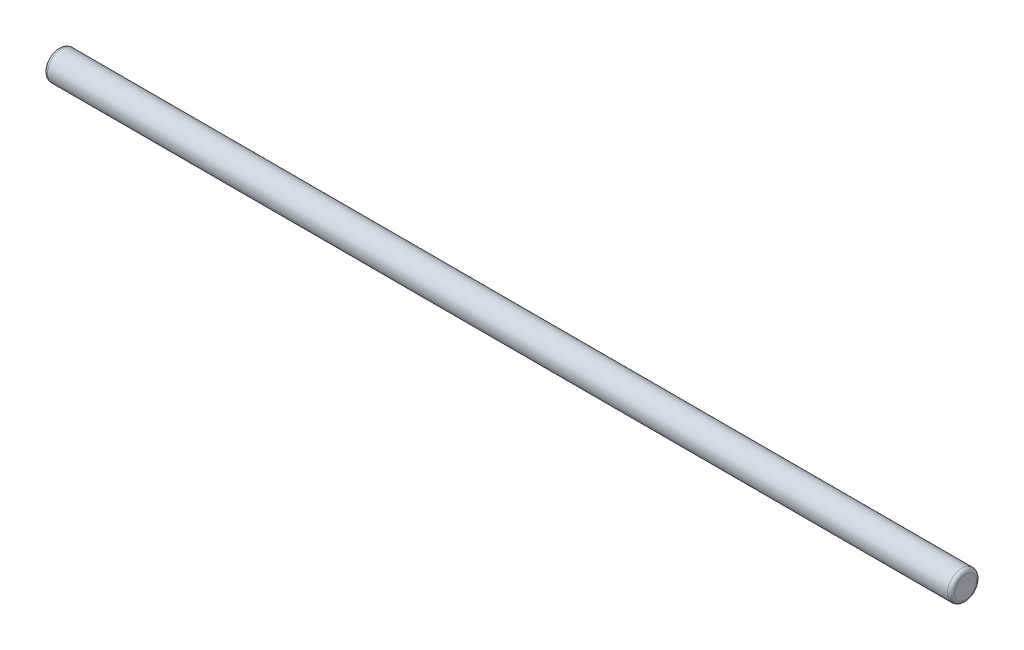
ISO-10303-21;
HEADER;
FILE_DESCRIPTION(('STEP AP214'),'2;1');
FILE_NAME('part.step','',(''),(''),'','','');
FILE_SCHEMA(('AUTOMOTIVE_DESIGN { 1 0 10303 214 1 1 1 1 }'));
ENDSEC;
DATA;
#1=APPLICATION_CONTEXT('core data for automotive mechanical design processes');
#2=APPLICATION_PROTOCOL_DEFINITION('international standard','automotive_design',2000,#1);
#3=PRODUCT_CONTEXT('',#1,'mechanical');
#4=PRODUCT('Part','Part','',(#3));
#5=PRODUCT_RELATED_PRODUCT_CATEGORY('part','',(#4));
#6=PRODUCT_DEFINITION_FORMATION('','',#4);
#7=PRODUCT_DEFINITION_CONTEXT('part definition',#1,'design');
#8=PRODUCT_DEFINITION('design','',#6,#7);
#9=PRODUCT_DEFINITION_SHAPE('','',#8);
#10=(LENGTH_UNIT() NAMED_UNIT(*) SI_UNIT(.MILLI.,.METRE.));
#11=(NAMED_UNIT(*) PLANE_ANGLE_UNIT() SI_UNIT($,.RADIAN.));
#12=(NAMED_UNIT(*) SI_UNIT($,.STERADIAN.) SOLID_ANGLE_UNIT());
#13=UNCERTAINTY_MEASURE_WITH_UNIT(LENGTH_MEASURE(1.E-05),#10,'distance_accuracy_value','');
#14=(GEOMETRIC_REPRESENTATION_CONTEXT(3) GLOBAL_UNCERTAINTY_ASSIGNED_CONTEXT((#13)) GLOBAL_UNIT_ASSIGNED_CONTEXT((#10,
#11,#12)) REPRESENTATION_CONTEXT('',''));
#15=CARTESIAN_POINT('',(0.,0.,0.));
#16=DIRECTION('',(0.,0.,1.));
#17=DIRECTION('',(1.,0.,0.));
#18=AXIS2_PLACEMENT_3D('',#15,#16,#17);
#19=CARTESIAN_POINT('',(250.,0.,0.));
#20=DIRECTION('',(-1.,0.,0.));
#21=DIRECTION('',(0.,0.,1.));
#22=AXIS2_PLACEMENT_3D('',#19,#20,#21);
#23=CYLINDRICAL_SURFACE('',#22,4.);
#24=CARTESIAN_POINT('',(1.,0.,0.));
#25=DIRECTION('',(1.,0.,0.));
#26=DIRECTION('',(0.,0.,-1.));
#27=AXIS2_PLACEMENT_3D('',#24,#25,#26);
#28=CIRCLE('',#27,4.);
#29=CARTESIAN_POINT('',(1.,0.,-4.));
#30=VERTEX_POINT('',#29);
#31=EDGE_CURVE('E48',#30,#30,#28,.T.);
#32=ORIENTED_EDGE('',*,*,#31,.T.);
#33=EDGE_LOOP('',(#32));
#34=FACE_BOUND('',#33,.T.);
#35=CARTESIAN_POINT('',(249.,0.,0.));
#36=DIRECTION('',(1.,0.,0.));
#37=DIRECTION('',(0.,0.,-1.));
#38=AXIS2_PLACEMENT_3D('',#35,#36,#37);
#39=CIRCLE('',#38,4.);
#40=CARTESIAN_POINT('',(249.,0.,-4.));
#41=VERTEX_POINT('',#40);
#42=EDGE_CURVE('E52',#41,#41,#39,.F.);
#43=ORIENTED_EDGE('',*,*,#42,.T.);
#44=EDGE_LOOP('',(#43));
#45=FACE_BOUND('',#44,.T.);
#46=ADVANCED_FACE('F37',(#34,#45),#23,.T.);
#47=CARTESIAN_POINT('',(250.,0.,0.));
#48=DIRECTION('',(1.,0.,0.));
#49=DIRECTION('',(0.,0.,-1.));
#50=AXIS2_PLACEMENT_3D('',#47,#48,#49);
#51=PLANE('',#50);
#52=CARTESIAN_POINT('',(250.,0.,0.));
#53=DIRECTION('',(1.,0.,0.));
#54=DIRECTION('',(0.,0.,-1.));
#55=AXIS2_PLACEMENT_3D('',#52,#53,#54);
#56=CIRCLE('',#55,3.);
#57=CARTESIAN_POINT('',(250.,0.,-3.));
#58=VERTEX_POINT('',#57);
#59=EDGE_CURVE('E10',#58,#58,#56,.T.);
#60=ORIENTED_EDGE('',*,*,#59,.T.);
#61=EDGE_LOOP('',(#60));
#62=FACE_BOUND('',#61,.T.);
#63=ADVANCED_FACE('F68',(#62),#51,.T.);
#64=CARTESIAN_POINT('',(0.,0.,0.));
#65=DIRECTION('',(1.,0.,0.));
#66=DIRECTION('',(0.,0.,-1.));
#67=AXIS2_PLACEMENT_3D('',#64,#65,#66);
#68=PLANE('',#67);
#69=CARTESIAN_POINT('',(0.,0.,0.));
#70=DIRECTION('',(1.,0.,0.));
#71=DIRECTION('',(0.,0.,-1.));
#72=AXIS2_PLACEMENT_3D('',#69,#70,#71);
#73=CIRCLE('',#72,3.);
#74=CARTESIAN_POINT('',(0.,0.,-3.));
#75=VERTEX_POINT('',#74);
#76=EDGE_CURVE('E44',#75,#75,#73,.F.);
#77=ORIENTED_EDGE('',*,*,#76,.T.);
#78=EDGE_LOOP('',(#77));
#79=FACE_BOUND('',#78,.T.);
#80=ADVANCED_FACE('F65',(#79),#68,.F.);
#81=CARTESIAN_POINT('',(1.,0.,0.));
#82=DIRECTION('',(1.,0.,0.));
#83=DIRECTION('',(0.,0.,-1.));
#84=AXIS2_PLACEMENT_3D('',#81,#82,#83);
#85=TOROIDAL_SURFACE('',#84,3.,1.);
#86=ORIENTED_EDGE('',*,*,#76,.F.);
#87=EDGE_LOOP('',(#86));
#88=FACE_BOUND('',#87,.T.);
#89=ORIENTED_EDGE('',*,*,#31,.F.);
#90=EDGE_LOOP('',(#89));
#91=FACE_BOUND('',#90,.T.);
#92=ADVANCED_FACE('F61',(#88,#91),#85,.T.);
#93=CARTESIAN_POINT('',(249.,0.,0.));
#94=DIRECTION('',(1.,0.,0.));
#95=DIRECTION('',(0.,0.,-1.));
#96=AXIS2_PLACEMENT_3D('',#93,#94,#95);
#97=TOROIDAL_SURFACE('',#96,3.,1.);
#98=ORIENTED_EDGE('',*,*,#42,.F.);
#99=EDGE_LOOP('',(#98));
#100=FACE_BOUND('',#99,.T.);
#101=ORIENTED_EDGE('',*,*,#59,.F.);
#102=EDGE_LOOP('',(#101));
#103=FACE_BOUND('',#102,.T.);
#104=ADVANCED_FACE('F39',(#100,#103),#97,.T.);
#105=CLOSED_SHELL('',(#46,#63,#80,#92,#104));
#106=MANIFOLD_SOLID_BREP('B2',#105);
#107=ADVANCED_BREP_SHAPE_REPRESENTATION('',(#18,#106),#14);
#108=SHAPE_DEFINITION_REPRESENTATION(#9,#107);
ENDSEC;
END-ISO-10303-21;
